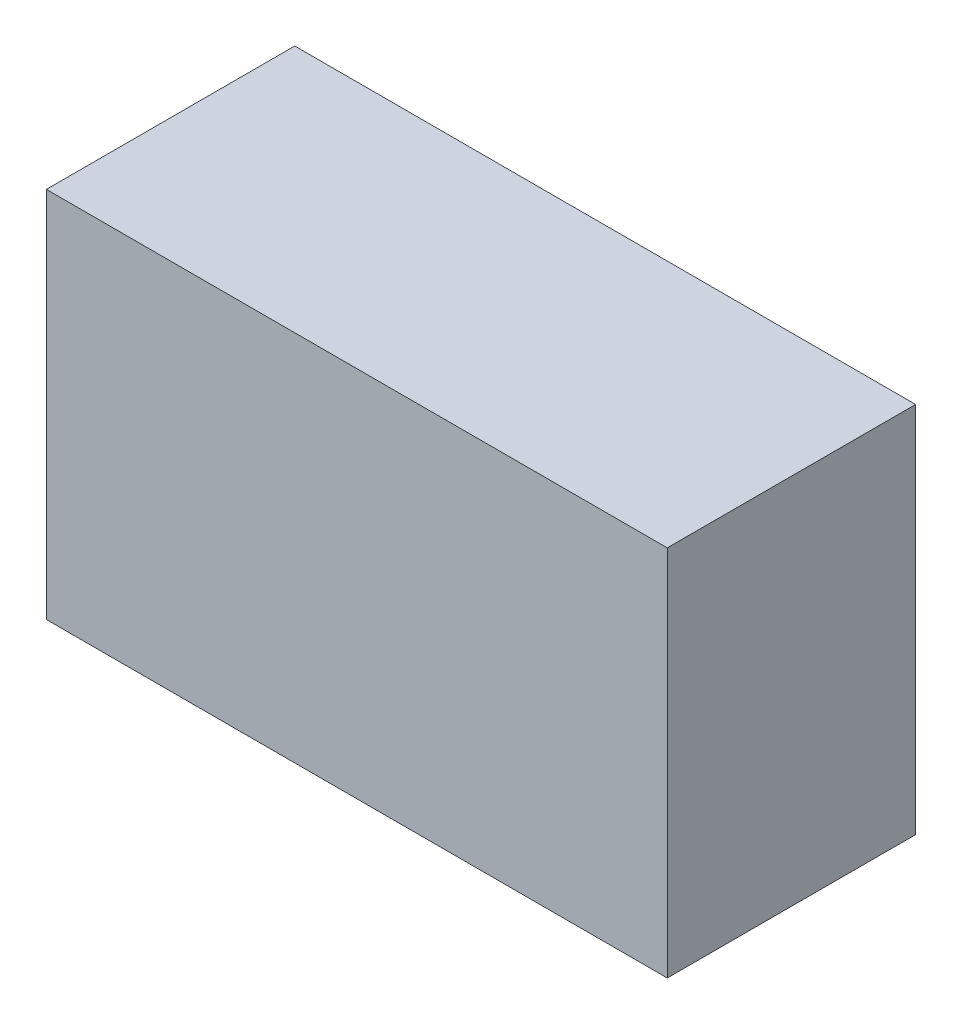
ISO-10303-21;
HEADER;
FILE_DESCRIPTION(('STEP AP214'),'2;1');
FILE_NAME('part.step','',(''),(''),'','','');
FILE_SCHEMA(('AUTOMOTIVE_DESIGN { 1 0 10303 214 1 1 1 1 }'));
ENDSEC;
DATA;
#1=APPLICATION_CONTEXT('core data for automotive mechanical design processes');
#2=APPLICATION_PROTOCOL_DEFINITION('international standard','automotive_design',2000,#1);
#3=PRODUCT_CONTEXT('',#1,'mechanical');
#4=PRODUCT('Part','Part','',(#3));
#5=PRODUCT_RELATED_PRODUCT_CATEGORY('part','',(#4));
#6=PRODUCT_DEFINITION_FORMATION('','',#4);
#7=PRODUCT_DEFINITION_CONTEXT('part definition',#1,'design');
#8=PRODUCT_DEFINITION('design','',#6,#7);
#9=PRODUCT_DEFINITION_SHAPE('','',#8);
#10=(LENGTH_UNIT() NAMED_UNIT(*) SI_UNIT(.MILLI.,.METRE.));
#11=(NAMED_UNIT(*) PLANE_ANGLE_UNIT() SI_UNIT($,.RADIAN.));
#12=(NAMED_UNIT(*) SI_UNIT($,.STERADIAN.) SOLID_ANGLE_UNIT());
#13=UNCERTAINTY_MEASURE_WITH_UNIT(LENGTH_MEASURE(1.E-05),#10,'distance_accuracy_value','');
#14=(GEOMETRIC_REPRESENTATION_CONTEXT(3) GLOBAL_UNCERTAINTY_ASSIGNED_CONTEXT((#13)) GLOBAL_UNIT_ASSIGNED_CONTEXT((#10,
#11,#12)) REPRESENTATION_CONTEXT('',''));
#15=CARTESIAN_POINT('',(0.,0.,0.));
#16=DIRECTION('',(0.,0.,1.));
#17=DIRECTION('',(1.,0.,0.));
#18=AXIS2_PLACEMENT_3D('',#15,#16,#17);
#19=CARTESIAN_POINT('',(-0.437499999999999,8.90625,8.5));
#20=DIRECTION('',(1.,0.,0.));
#21=DIRECTION('',(0.,0.,-1.));
#22=AXIS2_PLACEMENT_3D('',#19,#20,#21);
#23=PLANE('',#22);
#24=DIRECTION('',(0.,-1.,0.));
#25=VECTOR('',#24,1.);
#26=CARTESIAN_POINT('',(-0.437499999999999,8.90625,1.5));
#27=LINE('',#26,#25);
#28=CARTESIAN_POINT('',(-0.437499999999999,8.90625,1.5));
#29=VERTEX_POINT('',#28);
#30=CARTESIAN_POINT('',(-0.437499999999999,-1.59375,1.5));
#31=VERTEX_POINT('',#30);
#32=EDGE_CURVE('E99',#29,#31,#27,.T.);
#33=ORIENTED_EDGE('',*,*,#32,.T.);
#34=DIRECTION('',(0.,0.,-1.));
#35=VECTOR('',#34,1.);
#36=CARTESIAN_POINT('',(-0.437499999999999,-1.59375,8.5));
#37=LINE('',#36,#35);
#38=CARTESIAN_POINT('',(-0.437499999999999,-1.59375,8.5));
#39=VERTEX_POINT('',#38);
#40=EDGE_CURVE('E11',#39,#31,#37,.T.);
#41=ORIENTED_EDGE('',*,*,#40,.F.);
#42=DIRECTION('',(0.,-1.,0.));
#43=VECTOR('',#42,1.);
#44=CARTESIAN_POINT('',(-0.437499999999999,8.90625,8.5));
#45=LINE('',#44,#43);
#46=CARTESIAN_POINT('',(-0.437499999999999,8.90625,8.5));
#47=VERTEX_POINT('',#46);
#48=EDGE_CURVE('E87',#47,#39,#45,.T.);
#49=ORIENTED_EDGE('',*,*,#48,.F.);
#50=DIRECTION('',(0.,0.,-1.));
#51=VECTOR('',#50,1.);
#52=CARTESIAN_POINT('',(-0.437499999999999,8.90625,8.5));
#53=LINE('',#52,#51);
#54=EDGE_CURVE('E95',#47,#29,#53,.T.);
#55=ORIENTED_EDGE('',*,*,#54,.T.);
#56=EDGE_LOOP('',(#33,#41,#49,#55));
#57=FACE_BOUND('',#56,.T.);
#58=ADVANCED_FACE('F36',(#57),#23,.F.);
#59=CARTESIAN_POINT('',(-0.437499999999999,-1.59375,8.5));
#60=DIRECTION('',(0.,1.,0.));
#61=DIRECTION('',(0.,0.,1.));
#62=AXIS2_PLACEMENT_3D('',#59,#60,#61);
#63=PLANE('',#62);
#64=DIRECTION('',(1.,0.,0.));
#65=VECTOR('',#64,1.);
#66=CARTESIAN_POINT('',(-0.437499999999999,-1.59375,1.5));
#67=LINE('',#66,#65);
#68=CARTESIAN_POINT('',(17.0625,-1.59375,1.5));
#69=VERTEX_POINT('',#68);
#70=EDGE_CURVE('E91',#31,#69,#67,.T.);
#71=ORIENTED_EDGE('',*,*,#70,.T.);
#72=DIRECTION('',(0.,0.,-1.));
#73=VECTOR('',#72,1.);
#74=CARTESIAN_POINT('',(17.0625,-1.59375,8.5));
#75=LINE('',#74,#73);
#76=CARTESIAN_POINT('',(17.0625,-1.59375,8.5));
#77=VERTEX_POINT('',#76);
#78=EDGE_CURVE('E44',#77,#69,#75,.T.);
#79=ORIENTED_EDGE('',*,*,#78,.F.);
#80=DIRECTION('',(1.,0.,0.));
#81=VECTOR('',#80,1.);
#82=CARTESIAN_POINT('',(-0.437499999999999,-1.59375,8.5));
#83=LINE('',#82,#81);
#84=EDGE_CURVE('E82',#39,#77,#83,.T.);
#85=ORIENTED_EDGE('',*,*,#84,.F.);
#86=ORIENTED_EDGE('',*,*,#40,.T.);
#87=EDGE_LOOP('',(#71,#79,#85,#86));
#88=FACE_BOUND('',#87,.T.);
#89=ADVANCED_FACE('F90',(#88),#63,.F.);
#90=CARTESIAN_POINT('',(17.0625,8.90625,8.5));
#91=DIRECTION('',(-1.,0.,0.));
#92=DIRECTION('',(0.,0.,1.));
#93=AXIS2_PLACEMENT_3D('',#90,#91,#92);
#94=PLANE('',#93);
#95=DIRECTION('',(0.,1.,0.));
#96=VECTOR('',#95,1.);
#97=CARTESIAN_POINT('',(17.0625,8.90625,1.5));
#98=LINE('',#97,#96);
#99=CARTESIAN_POINT('',(17.0625,8.90625,1.5));
#100=VERTEX_POINT('',#99);
#101=EDGE_CURVE('E69',#69,#100,#98,.T.);
#102=ORIENTED_EDGE('',*,*,#101,.T.);
#103=DIRECTION('',(0.,0.,-1.));
#104=VECTOR('',#103,1.);
#105=CARTESIAN_POINT('',(17.0625,8.90625,8.5));
#106=LINE('',#105,#104);
#107=CARTESIAN_POINT('',(17.0625,8.90625,8.5));
#108=VERTEX_POINT('',#107);
#109=EDGE_CURVE('E92',#108,#100,#106,.T.);
#110=ORIENTED_EDGE('',*,*,#109,.F.);
#111=DIRECTION('',(0.,1.,0.));
#112=VECTOR('',#111,1.);
#113=CARTESIAN_POINT('',(17.0625,8.90625,8.5));
#114=LINE('',#113,#112);
#115=EDGE_CURVE('E85',#77,#108,#114,.T.);
#116=ORIENTED_EDGE('',*,*,#115,.F.);
#117=ORIENTED_EDGE('',*,*,#78,.T.);
#118=EDGE_LOOP('',(#102,#110,#116,#117));
#119=FACE_BOUND('',#118,.T.);
#120=ADVANCED_FACE('F93',(#119),#94,.F.);
#121=CARTESIAN_POINT('',(-0.437499999999999,8.90625,8.5));
#122=DIRECTION('',(0.,-1.,0.));
#123=DIRECTION('',(0.,0.,-1.));
#124=AXIS2_PLACEMENT_3D('',#121,#122,#123);
#125=PLANE('',#124);
#126=DIRECTION('',(-1.,0.,0.));
#127=VECTOR('',#126,1.);
#128=CARTESIAN_POINT('',(-0.437499999999999,8.90625,1.5));
#129=LINE('',#128,#127);
#130=EDGE_CURVE('E75',#100,#29,#129,.T.);
#131=ORIENTED_EDGE('',*,*,#130,.T.);
#132=ORIENTED_EDGE('',*,*,#54,.F.);
#133=DIRECTION('',(-1.,0.,0.));
#134=VECTOR('',#133,1.);
#135=CARTESIAN_POINT('',(-0.437499999999999,8.90625,8.5));
#136=LINE('',#135,#134);
#137=EDGE_CURVE('E52',#108,#47,#136,.T.);
#138=ORIENTED_EDGE('',*,*,#137,.F.);
#139=ORIENTED_EDGE('',*,*,#109,.T.);
#140=EDGE_LOOP('',(#131,#132,#138,#139));
#141=FACE_BOUND('',#140,.T.);
#142=ADVANCED_FACE('F106',(#141),#125,.F.);
#143=CARTESIAN_POINT('',(2.49375,1.096875,8.5));
#144=DIRECTION('',(0.,0.,1.));
#145=DIRECTION('',(1.,0.,0.));
#146=AXIS2_PLACEMENT_3D('',#143,#144,#145);
#147=PLANE('',#146);
#148=ORIENTED_EDGE('',*,*,#48,.T.);
#149=ORIENTED_EDGE('',*,*,#84,.T.);
#150=ORIENTED_EDGE('',*,*,#115,.T.);
#151=ORIENTED_EDGE('',*,*,#137,.T.);
#152=EDGE_LOOP('',(#148,#149,#150,#151));
#153=FACE_BOUND('',#152,.T.);
#154=ADVANCED_FACE('F83',(#153),#147,.T.);
#155=CARTESIAN_POINT('',(2.49375,1.096875,1.5));
#156=DIRECTION('',(0.,0.,1.));
#157=DIRECTION('',(1.,0.,0.));
#158=AXIS2_PLACEMENT_3D('',#155,#156,#157);
#159=PLANE('',#158);
#160=ORIENTED_EDGE('',*,*,#32,.F.);
#161=ORIENTED_EDGE('',*,*,#130,.F.);
#162=ORIENTED_EDGE('',*,*,#101,.F.);
#163=ORIENTED_EDGE('',*,*,#70,.F.);
#164=EDGE_LOOP('',(#160,#161,#162,#163));
#165=FACE_BOUND('',#164,.T.);
#166=ADVANCED_FACE('F109',(#165),#159,.F.);
#167=CLOSED_SHELL('',(#58,#89,#120,#142,#154,#166));
#168=MANIFOLD_SOLID_BREP('B2',#167);
#169=ADVANCED_BREP_SHAPE_REPRESENTATION('',(#18,#168),#14);
#170=SHAPE_DEFINITION_REPRESENTATION(#9,#169);
ENDSEC;
END-ISO-10303-21;
